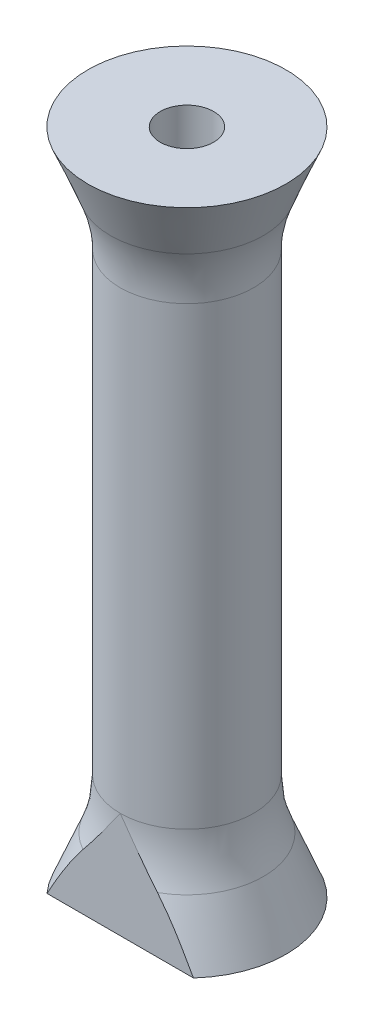
ISO-10303-21;
HEADER;
FILE_DESCRIPTION(('STEP AP214'),'2;1');
FILE_NAME('part.step','',(''),(''),'','','');
FILE_SCHEMA(('AUTOMOTIVE_DESIGN { 1 0 10303 214 1 1 1 1 }'));
ENDSEC;
DATA;
#1=APPLICATION_CONTEXT('core data for automotive mechanical design processes');
#2=APPLICATION_PROTOCOL_DEFINITION('international standard','automotive_design',2000,#1);
#3=PRODUCT_CONTEXT('',#1,'mechanical');
#4=PRODUCT('Part','Part','',(#3));
#5=PRODUCT_RELATED_PRODUCT_CATEGORY('part','',(#4));
#6=PRODUCT_DEFINITION_FORMATION('','',#4);
#7=PRODUCT_DEFINITION_CONTEXT('part definition',#1,'design');
#8=PRODUCT_DEFINITION('design','',#6,#7);
#9=PRODUCT_DEFINITION_SHAPE('','',#8);
#10=(LENGTH_UNIT() NAMED_UNIT(*) SI_UNIT(.MILLI.,.METRE.));
#11=(NAMED_UNIT(*) PLANE_ANGLE_UNIT() SI_UNIT($,.RADIAN.));
#12=(NAMED_UNIT(*) SI_UNIT($,.STERADIAN.) SOLID_ANGLE_UNIT());
#13=UNCERTAINTY_MEASURE_WITH_UNIT(LENGTH_MEASURE(1.E-05),#10,'distance_accuracy_value','');
#14=(GEOMETRIC_REPRESENTATION_CONTEXT(3) GLOBAL_UNCERTAINTY_ASSIGNED_CONTEXT((#13)) GLOBAL_UNIT_ASSIGNED_CONTEXT((#10,
#11,#12)) REPRESENTATION_CONTEXT('',''));
#15=CARTESIAN_POINT('',(0.,0.,0.));
#16=DIRECTION('',(0.,0.,1.));
#17=DIRECTION('',(1.,0.,0.));
#18=AXIS2_PLACEMENT_3D('',#15,#16,#17);
#19=CARTESIAN_POINT('',(0.,0.,0.));
#20=DIRECTION('',(0.,1.,0.));
#21=DIRECTION('',(0.,0.,1.));
#22=AXIS2_PLACEMENT_3D('',#19,#20,#21);
#23=PLANE('',#22);
#24=CARTESIAN_POINT('',(0.,0.,0.));
#25=DIRECTION('',(0.,1.,0.));
#26=DIRECTION('',(0.,0.,1.));
#27=AXIS2_PLACEMENT_3D('',#24,#25,#26);
#28=CIRCLE('',#27,2.54);
#29=CARTESIAN_POINT('',(0.,0.,2.54));
#30=VERTEX_POINT('',#29);
#31=EDGE_CURVE('E151',#30,#30,#28,.T.);
#32=ORIENTED_EDGE('',*,*,#31,.T.);
#33=EDGE_LOOP('',(#32));
#34=FACE_BOUND('',#33,.T.);
#35=DIRECTION('',(1.,0.,0.));
#36=VECTOR('',#35,1.);
#37=CARTESIAN_POINT('',(0.,0.,6.35));
#38=LINE('',#37,#36);
#39=CARTESIAN_POINT('',(-6.96975634735617,0.,6.35));
#40=VERTEX_POINT('',#39);
#41=CARTESIAN_POINT('',(6.96975634735616,0.,6.35));
#42=VERTEX_POINT('',#41);
#43=EDGE_CURVE('E154',#40,#42,#38,.T.);
#44=ORIENTED_EDGE('',*,*,#43,.F.);
#45=CARTESIAN_POINT('',(0.,0.,0.));
#46=DIRECTION('',(0.,1.,0.));
#47=DIRECTION('',(0.,0.,1.));
#48=AXIS2_PLACEMENT_3D('',#45,#46,#47);
#49=CIRCLE('',#48,9.42867984086381);
#50=EDGE_CURVE('E91',#40,#42,#49,.F.);
#51=ORIENTED_EDGE('',*,*,#50,.T.);
#52=EDGE_LOOP('',(#44,#51));
#53=FACE_BOUND('',#52,.T.);
#54=ADVANCED_FACE('F39',(#34,#53),#23,.F.);
#55=CARTESIAN_POINT('',(0.,-0.238400759596957,0.));
#56=DIRECTION('',(0.,-1.,0.));
#57=DIRECTION('',(0.,0.,-1.));
#58=AXIS2_PLACEMENT_3D('',#55,#56,#57);
#59=CONICAL_SURFACE('',#58,9.525,0.383972435438749);
#60=ORIENTED_EDGE('',*,*,#50,.F.);
#61=CARTESIAN_POINT('',(-6.97013893900264,-0.000700000000000125,6.35));
#62=CARTESIAN_POINT('',(-6.81004517567397,0.292103212405889,6.35));
#63=CARTESIAN_POINT('',(-6.64810796811134,0.583919319770703,6.35));
#64=CARTESIAN_POINT('',(-6.31948772308124,1.16508200067252,6.35));
#65=CARTESIAN_POINT('',(-6.15280204437464,1.45442707868588,6.35));
#66=CARTESIAN_POINT('',(-5.81003488258008,2.0362184287613,6.35));
#67=CARTESIAN_POINT('',(-5.63382687181748,2.3285905036498,6.35));
#68=CARTESIAN_POINT('',(-5.27411564908504,2.90868691650786,6.35));
#69=CARTESIAN_POINT('',(-5.09061496582144,3.19641281768469,6.35));
#70=CARTESIAN_POINT('',(-4.71401407427171,3.76606259331294,6.35));
#71=CARTESIAN_POINT('',(-4.52090285869401,4.04797926642675,6.35));
#72=CARTESIAN_POINT('',(-4.22187436560798,4.46436943762836,6.35));
#73=CARTESIAN_POINT('',(-4.12057749019999,4.60216206892264,6.35));
#74=CARTESIAN_POINT('',(-3.9143867171157,4.87502330360309,6.35));
#75=CARTESIAN_POINT('',(-3.8094930946504,5.01009211415646,6.35));
#76=CARTESIAN_POINT('',(-3.59641049978492,5.27574332584678,6.35));
#77=CARTESIAN_POINT('',(-3.48825692562477,5.40635402020095,6.35));
#78=CARTESIAN_POINT('',(-3.26711438587949,5.66339850538937,6.35));
#79=CARTESIAN_POINT('',(-3.15412627156554,5.78983302467841,6.35));
#80=CARTESIAN_POINT('',(-2.92262042899128,6.03714443441524,6.35));
#81=CARTESIAN_POINT('',(-2.80411283287643,6.15803075778584,6.35));
#82=CARTESIAN_POINT('',(-2.56037206007978,6.39277697152771,6.35));
#83=CARTESIAN_POINT('',(-2.43514236117838,6.50664043098626,6.35));
#84=CARTESIAN_POINT('',(-2.22608875177381,6.68324512688701,6.35));
#85=CARTESIAN_POINT('',(-2.14472956579056,6.74889453982832,6.35));
#86=CARTESIAN_POINT('',(-1.97866769544393,6.87581945886737,6.35));
#87=CARTESIAN_POINT('',(-1.8939645474711,6.93709435514814,6.35));
#88=CARTESIAN_POINT('',(-1.63453332744474,7.11289844141844,6.35));
#89=CARTESIAN_POINT('',(-1.45425334817479,7.21960802754281,6.35));
#90=CARTESIAN_POINT('',(-1.11787243456945,7.3823484789556,6.35));
#91=CARTESIAN_POINT('',(-0.964727609792902,7.44432513325945,6.35));
#92=CARTESIAN_POINT('',(-0.729052649699295,7.51793228799181,6.35));
#93=CARTESIAN_POINT('',(-0.649514668273621,7.53923982750899,6.35));
#94=CARTESIAN_POINT('',(-0.4888809654685,7.57473032610451,6.35));
#95=CARTESIAN_POINT('',(-0.407786019009823,7.58891673866674,6.35));
#96=CARTESIAN_POINT('',(-0.243877713400388,7.60972924419288,6.35));
#97=CARTESIAN_POINT('',(-0.161055447478268,7.61628584710751,6.35));
#98=CARTESIAN_POINT('',(0.00483399240188284,7.62133609919837,6.35));
#99=CARTESIAN_POINT('',(0.0879011582394427,7.61983001278036,6.35));
#100=CARTESIAN_POINT('',(0.253497604666313,7.60881459639695,6.35));
#101=CARTESIAN_POINT('',(0.336026907127897,7.59930559394339,6.35));
#102=CARTESIAN_POINT('',(0.499867335378266,7.57268174091587,6.35));
#103=CARTESIAN_POINT('',(0.581177762981086,7.5555626912991,6.35));
#104=CARTESIAN_POINT('',(0.84626732915803,7.48753503596905,6.35));
#105=CARTESIAN_POINT('',(1.02628597348128,7.42158758362363,6.35));
#106=CARTESIAN_POINT('',(1.37353531927445,7.26213874774928,6.35));
#107=CARTESIAN_POINT('',(1.54073177199306,7.16856659981635,6.35));
#108=CARTESIAN_POINT('',(1.85006588000982,6.97036546006456,6.35));
#109=CARTESIAN_POINT('',(1.99314094474013,6.86716702254104,6.35));
#110=CARTESIAN_POINT('',(2.27011474074859,6.64901472935314,6.35));
#111=CARTESIAN_POINT('',(2.4040044346438,6.53404956593007,6.35));
#112=CARTESIAN_POINT('',(2.66496584524021,6.2946562707452,6.35));
#113=CARTESIAN_POINT('',(2.791973260494,6.17015878565897,6.35));
#114=CARTESIAN_POINT('',(3.03922167998365,5.91479537239364,6.35));
#115=CARTESIAN_POINT('',(3.15946612751724,5.78393274942608,6.35));
#116=CARTESIAN_POINT('',(3.46917522210618,5.4324310283743,6.35));
#117=CARTESIAN_POINT('',(3.6539638784277,5.20768396052708,6.35));
#118=CARTESIAN_POINT('',(4.0122806609347,4.74933364978468,6.35));
#119=CARTESIAN_POINT('',(4.18580308031376,4.51572601210738,6.35));
#120=CARTESIAN_POINT('',(4.52445476218815,4.04165265961593,6.35));
#121=CARTESIAN_POINT('',(4.6895619399301,3.80117124900004,6.35));
#122=CARTESIAN_POINT('',(5.01276166978252,3.31553489552609,6.35));
#123=CARTESIAN_POINT('',(5.17085359413571,3.07037953721661,6.35));
#124=CARTESIAN_POINT('',(5.47150602103984,2.59216515779034,6.35));
#125=CARTESIAN_POINT('',(5.6144157079782,2.35932484648929,6.35));
#126=CARTESIAN_POINT('',(5.89609047143868,1.89113411022604,6.35));
#127=CARTESIAN_POINT('',(6.03485525898995,1.65578351179869,6.35));
#128=CARTESIAN_POINT('',(6.30805689305711,1.18449393108008,6.35));
#129=CARTESIAN_POINT('',(6.4425148849503,0.948567175528929,6.35));
#130=CARTESIAN_POINT('',(6.70844140062923,0.475083254206333,6.35));
#131=CARTESIAN_POINT('',(6.83991040079254,0.23752635621156,6.35));
#132=CARTESIAN_POINT('',(6.97013893900274,-0.000699999999908097,6.35));
#133=B_SPLINE_CURVE_WITH_KNOTS('',3,(#61,#62,#63,#64,#65,#66,#67,#68,#69,#70,#71,#72,#73,#74,
#75,#76,#77,#78,#79,#80,#81,#82,#83,#84,#85,#86,#87,#88,#89,#90,#91,#92,#93,#94,#95,#96,#97,#98,
#99,#100,#101,#102,#103,#104,#105,#106,#107,#108,#109,#110,#111,#112,#113,#114,#115,#116,#117,
#118,#119,#120,#121,#122,#123,#124,#125,#126,#127,#128,#129,#130,#131,#132),.UNSPECIFIED.,.F.,
.F.,(4,2,2,2,2,2,2,2,2,2,2,2,2,2,2,2,2,2,2,2,2,2,2,2,2,2,2,2,2,2,2,2,2,2,2,4),(0.,
1.00115644808138,2.00288108175956,3.0268894601828,4.05054581371938,5.07540286398049,
5.5884167468968,6.10139146292962,6.61002518109493,7.11856970409367,7.62621489677029,
8.13359993658918,8.44709176513384,8.76062721011916,9.38678631370557,9.88044487999217,
10.1271946774974,10.3738246945615,10.6226837870805,10.8715347186282,11.1203754666798,
11.3693536898881,11.940983888247,12.5140912920629,13.042522515622,13.571466413618,
14.1047118955755,14.6376833763588,15.5100166595783,16.3827884220977,17.2577437487267,
18.1327772131589,18.9523242986994,19.7719283880546,20.5865613399548,21.4010635345266),.UNSPECIFIED.);
#134=CARTESIAN_POINT('',(-3.5496065259517,5.33112618966682,6.35));
#135=VERTEX_POINT('',#134);
#136=EDGE_CURVE('E65',#40,#135,#133,.T.);
#137=ORIENTED_EDGE('',*,*,#136,.T.);
#138=CARTESIAN_POINT('',(0.,5.33112618966682,0.));
#139=DIRECTION('',(0.,1.,0.));
#140=DIRECTION('',(0.,0.,1.));
#141=AXIS2_PLACEMENT_3D('',#138,#139,#140);
#142=CIRCLE('',#141,7.27476504700178);
#143=CARTESIAN_POINT('',(3.5496065259517,5.33112618966682,6.35));
#144=VERTEX_POINT('',#143);
#145=EDGE_CURVE('E82',#135,#144,#142,.F.);
#146=ORIENTED_EDGE('',*,*,#145,.T.);
#147=EDGE_CURVE('E60',#144,#42,#133,.T.);
#148=ORIENTED_EDGE('',*,*,#147,.T.);
#149=EDGE_LOOP('',(#60,#137,#146,#148));
#150=FACE_BOUND('',#149,.T.);
#151=ADVANCED_FACE('F107',(#150),#59,.T.);
#152=CARTESIAN_POINT('',(0.,10.0886299260489,0.));
#153=DIRECTION('',(0.,-1.,0.));
#154=DIRECTION('',(0.,0.,-1.));
#155=AXIS2_PLACEMENT_3D('',#152,#153,#154);
#156=TOROIDAL_SURFACE('',#155,19.05,12.7);
#157=CARTESIAN_POINT('',(0.,10.0886299260489,6.35));
#158=CARTESIAN_POINT('',(-0.00433759777164589,10.0824956320214,6.35));
#159=CARTESIAN_POINT('',(-0.00867520256478168,10.0763613325385,6.35));
#160=CARTESIAN_POINT('',(-0.633256348061171,9.19307292394192,6.35));
#161=CARTESIAN_POINT('',(-1.25377938411385,8.31590861165454,6.35));
#162=CARTESIAN_POINT('',(-2.21435803418364,7.02159150882193,6.35));
#163=CARTESIAN_POINT('',(-2.53963162890958,6.59358294082852,6.35));
#164=CARTESIAN_POINT('',(-3.20443517125072,5.74873670818634,6.35));
#165=CARTESIAN_POINT('',(-3.54396448270959,5.3318985464192,6.35));
#166=CARTESIAN_POINT('',(-4.23802949207585,4.51724839889304,6.35));
#167=CARTESIAN_POINT('',(-4.59240291352514,4.1192990959117,6.35));
#168=CARTESIAN_POINT('',(-5.32194010506707,3.34296935215213,6.35));
#169=CARTESIAN_POINT('',(-5.6970993642744,2.96458469969859,6.35));
#170=CARTESIAN_POINT('',(-6.4698388217568,2.23261254002799,6.35));
#171=CARTESIAN_POINT('',(-6.86738154691996,1.87898568834324,6.35));
#172=CARTESIAN_POINT('',(-7.68649547709928,1.20093829294941,6.35));
#173=CARTESIAN_POINT('',(-8.10805569086619,0.876504562015245,6.35));
#174=CARTESIAN_POINT('',(-8.89703037551857,0.317349233792617,6.35));
#175=CARTESIAN_POINT('',(-9.26046251203705,0.0770106380098773,6.35));
#176=CARTESIAN_POINT('',(-10.0030342728683,-0.37791278949217,6.35));
#177=CARTESIAN_POINT('',(-10.3821702056453,-0.592503628107306,6.35));
#178=CARTESIAN_POINT('',(-11.1625645090648,-0.997043438623623,6.35));
#179=CARTESIAN_POINT('',(-11.564105032705,-1.18645224474474,6.35));
#180=CARTESIAN_POINT('',(-12.1768005888177,-1.44639356784458,6.35));
#181=CARTESIAN_POINT('',(-12.3828751549838,-1.52904939682536,6.35));
#182=CARTESIAN_POINT('',(-12.7982228921676,-1.68596154801072,6.35));
#183=CARTESIAN_POINT('',(-13.0074964228324,-1.76021691778222,6.35));
#184=CARTESIAN_POINT('',(-13.2182470726855,-1.83011544422518,6.35));
#185=B_SPLINE_CURVE_WITH_KNOTS('',3,(#157,#158,#159,#160,#161,#162,#163,#164,#165,#166,#167,
#168,#169,#170,#171,#172,#173,#174,#175,#176,#177,#178,#179,#180,#181,#182,#183,#184),
.UNSPECIFIED.,.F.,.F.,(4,2,2,2,2,2,2,2,2,2,2,2,2,4),(0.,0.0225388553391719,3.2454085588652,
4.85793426642827,6.47038809192242,8.06835143796614,9.66596934647811,11.2609878530028,
12.8552821963086,14.1614635358387,15.4673395511326,16.7978080926955,17.4637482672017,
18.1297638696251),.UNSPECIFIED.);
#186=CARTESIAN_POINT('',(0.,10.0886299260489,6.35));
#187=VERTEX_POINT('',#186);
#188=EDGE_CURVE('E11',#187,#135,#185,.T.);
#189=ORIENTED_EDGE('',*,*,#188,.F.);
#190=CARTESIAN_POINT('',(0.,10.0886299260489,0.));
#191=DIRECTION('',(0.,-1.,0.));
#192=DIRECTION('',(0.,0.,-1.));
#193=AXIS2_PLACEMENT_3D('',#190,#191,#192);
#194=CIRCLE('',#193,6.35);
#195=EDGE_CURVE('E81',#187,#187,#194,.F.);
#196=ORIENTED_EDGE('',*,*,#195,.F.);
#197=CARTESIAN_POINT('',(0.,10.0886299260489,6.35));
#198=CARTESIAN_POINT('',(0.00433759777164589,10.0824956320214,6.35));
#199=CARTESIAN_POINT('',(0.00867520256478168,10.0763613325385,6.35));
#200=CARTESIAN_POINT('',(0.633256348061171,9.19307292394192,6.35));
#201=CARTESIAN_POINT('',(1.25377938411385,8.31590861165454,6.35));
#202=CARTESIAN_POINT('',(2.21435803418364,7.02159150882193,6.35));
#203=CARTESIAN_POINT('',(2.53963162890958,6.59358294082852,6.35));
#204=CARTESIAN_POINT('',(3.20443517125072,5.74873670818634,6.35));
#205=CARTESIAN_POINT('',(3.54396448270959,5.3318985464192,6.35));
#206=CARTESIAN_POINT('',(4.23802949207585,4.51724839889304,6.35));
#207=CARTESIAN_POINT('',(4.59240291352514,4.1192990959117,6.35));
#208=CARTESIAN_POINT('',(5.32194010506707,3.34296935215213,6.35));
#209=CARTESIAN_POINT('',(5.6970993642744,2.96458469969859,6.35));
#210=CARTESIAN_POINT('',(6.4698388217568,2.23261254002799,6.35));
#211=CARTESIAN_POINT('',(6.86738154691996,1.87898568834324,6.35));
#212=CARTESIAN_POINT('',(7.68649547709928,1.20093829294941,6.35));
#213=CARTESIAN_POINT('',(8.10805569086619,0.876504562015245,6.35));
#214=CARTESIAN_POINT('',(8.89703037551857,0.317349233792617,6.35));
#215=CARTESIAN_POINT('',(9.26046251203705,0.0770106380098773,6.35));
#216=CARTESIAN_POINT('',(10.0030342728683,-0.37791278949217,6.35));
#217=CARTESIAN_POINT('',(10.3821702056453,-0.592503628107306,6.35));
#218=CARTESIAN_POINT('',(11.1625645090648,-0.997043438623623,6.35));
#219=CARTESIAN_POINT('',(11.564105032705,-1.18645224474474,6.35));
#220=CARTESIAN_POINT('',(12.1768005888177,-1.44639356784458,6.35));
#221=CARTESIAN_POINT('',(12.3828751549838,-1.52904939682536,6.35));
#222=CARTESIAN_POINT('',(12.7982228921676,-1.68596154801072,6.35));
#223=CARTESIAN_POINT('',(13.0074964228324,-1.76021691778222,6.35));
#224=CARTESIAN_POINT('',(13.2182470726855,-1.83011544422518,6.35));
#225=B_SPLINE_CURVE_WITH_KNOTS('',3,(#197,#198,#199,#200,#201,#202,#203,#204,#205,#206,#207,
#208,#209,#210,#211,#212,#213,#214,#215,#216,#217,#218,#219,#220,#221,#222,#223,#224),
.UNSPECIFIED.,.F.,.F.,(4,2,2,2,2,2,2,2,2,2,2,2,2,4),(0.,0.0225388553391719,3.2454085588652,
4.85793426642827,6.47038809192242,8.06835143796614,9.66596934647811,11.2609878530028,
12.8552821963086,14.1614635358387,15.4673395511326,16.7978080926955,17.4637482672017,
18.1297638696251),.UNSPECIFIED.);
#226=EDGE_CURVE('E53',#144,#187,#225,.F.);
#227=ORIENTED_EDGE('',*,*,#226,.F.);
#228=ORIENTED_EDGE('',*,*,#145,.F.);
#229=EDGE_LOOP('',(#189,#196,#227,#228));
#230=FACE_BOUND('',#229,.T.);
#231=ADVANCED_FACE('F80',(#230),#156,.F.);
#232=CARTESIAN_POINT('',(0.,63.5,0.));
#233=DIRECTION('',(0.,-1.,0.));
#234=DIRECTION('',(0.,0.,-1.));
#235=AXIS2_PLACEMENT_3D('',#232,#233,#234);
#236=CYLINDRICAL_SURFACE('',#235,6.35);
#237=ORIENTED_EDGE('',*,*,#195,.T.);
#238=EDGE_LOOP('',(#237));
#239=FACE_BOUND('',#238,.T.);
#240=CARTESIAN_POINT('',(0.,53.4113700739511,0.));
#241=DIRECTION('',(0.,1.,0.));
#242=DIRECTION('',(0.,0.,1.));
#243=AXIS2_PLACEMENT_3D('',#240,#241,#242);
#244=CIRCLE('',#243,6.35);
#245=CARTESIAN_POINT('',(0.,53.4113700739511,6.35));
#246=VERTEX_POINT('',#245);
#247=EDGE_CURVE('E78',#246,#246,#244,.F.);
#248=ORIENTED_EDGE('',*,*,#247,.T.);
#249=EDGE_LOOP('',(#248));
#250=FACE_BOUND('',#249,.T.);
#251=ADVANCED_FACE('F84',(#239,#250),#236,.T.);
#252=CARTESIAN_POINT('',(0.,63.5,0.));
#253=DIRECTION('',(0.,1.,0.));
#254=DIRECTION('',(0.,0.,1.));
#255=AXIS2_PLACEMENT_3D('',#252,#253,#254);
#256=PLANE('',#255);
#257=CARTESIAN_POINT('',(0.,63.5,0.));
#258=DIRECTION('',(0.,1.,0.));
#259=DIRECTION('',(0.,0.,1.));
#260=AXIS2_PLACEMENT_3D('',#257,#258,#259);
#261=CIRCLE('',#260,9.42867984086381);
#262=CARTESIAN_POINT('',(0.,63.5,9.42867984086381));
#263=VERTEX_POINT('',#262);
#264=EDGE_CURVE('E86',#263,#263,#261,.T.);
#265=ORIENTED_EDGE('',*,*,#264,.T.);
#266=EDGE_LOOP('',(#265));
#267=FACE_BOUND('',#266,.T.);
#268=CARTESIAN_POINT('',(0.,63.5,0.));
#269=DIRECTION('',(0.,1.,0.));
#270=DIRECTION('',(0.,0.,1.));
#271=AXIS2_PLACEMENT_3D('',#268,#269,#270);
#272=CIRCLE('',#271,2.54);
#273=CARTESIAN_POINT('',(0.,63.5,2.54));
#274=VERTEX_POINT('',#273);
#275=EDGE_CURVE('E150',#274,#274,#272,.T.);
#276=ORIENTED_EDGE('',*,*,#275,.F.);
#277=EDGE_LOOP('',(#276));
#278=FACE_BOUND('',#277,.T.);
#279=ADVANCED_FACE('F125',(#267,#278),#256,.T.);
#280=CARTESIAN_POINT('',(0.,63.5,0.));
#281=DIRECTION('',(0.,-1.,0.));
#282=DIRECTION('',(0.,0.,-1.));
#283=AXIS2_PLACEMENT_3D('',#280,#281,#282);
#284=CYLINDRICAL_SURFACE('',#283,2.54);
#285=ORIENTED_EDGE('',*,*,#275,.T.);
#286=EDGE_LOOP('',(#285));
#287=FACE_BOUND('',#286,.T.);
#288=ORIENTED_EDGE('',*,*,#31,.F.);
#289=EDGE_LOOP('',(#288));
#290=FACE_BOUND('',#289,.T.);
#291=ADVANCED_FACE('F117',(#287,#290),#284,.F.);
#292=CARTESIAN_POINT('',(0.,63.738400759597,0.));
#293=DIRECTION('',(0.,1.,0.));
#294=DIRECTION('',(0.,0.,1.));
#295=AXIS2_PLACEMENT_3D('',#292,#293,#294);
#296=CONICAL_SURFACE('',#295,9.525,0.383972435438749);
#297=CARTESIAN_POINT('',(0.,58.1688738103332,0.));
#298=DIRECTION('',(0.,-1.,0.));
#299=DIRECTION('',(0.,0.,-1.));
#300=AXIS2_PLACEMENT_3D('',#297,#298,#299);
#301=CIRCLE('',#300,7.27476504700178);
#302=CARTESIAN_POINT('',(0.,58.1688738103332,-7.27476504700178));
#303=VERTEX_POINT('',#302);
#304=EDGE_CURVE('E89',#303,#303,#301,.F.);
#305=ORIENTED_EDGE('',*,*,#304,.T.);
#306=EDGE_LOOP('',(#305));
#307=FACE_BOUND('',#306,.T.);
#308=ORIENTED_EDGE('',*,*,#264,.F.);
#309=EDGE_LOOP('',(#308));
#310=FACE_BOUND('',#309,.T.);
#311=ADVANCED_FACE('F112',(#307,#310),#296,.T.);
#312=CARTESIAN_POINT('',(0.,53.4113700739511,0.));
#313=DIRECTION('',(0.,1.,0.));
#314=DIRECTION('',(0.,0.,1.));
#315=AXIS2_PLACEMENT_3D('',#312,#313,#314);
#316=TOROIDAL_SURFACE('',#315,19.05,12.7);
#317=ORIENTED_EDGE('',*,*,#247,.F.);
#318=EDGE_LOOP('',(#317));
#319=FACE_BOUND('',#318,.T.);
#320=ORIENTED_EDGE('',*,*,#304,.F.);
#321=EDGE_LOOP('',(#320));
#322=FACE_BOUND('',#321,.T.);
#323=ADVANCED_FACE('F41',(#319,#322),#316,.F.);
#324=CARTESIAN_POINT('',(0.,0.,6.35));
#325=DIRECTION('',(0.,0.,1.));
#326=DIRECTION('',(1.,0.,0.));
#327=AXIS2_PLACEMENT_3D('',#324,#325,#326);
#328=PLANE('',#327);
#329=ORIENTED_EDGE('',*,*,#43,.T.);
#330=ORIENTED_EDGE('',*,*,#147,.F.);
#331=ORIENTED_EDGE('',*,*,#226,.T.);
#332=ORIENTED_EDGE('',*,*,#188,.T.);
#333=ORIENTED_EDGE('',*,*,#136,.F.);
#334=EDGE_LOOP('',(#329,#330,#331,#332,#333));
#335=FACE_BOUND('',#334,.T.);
#336=ADVANCED_FACE('F73',(#335),#328,.T.);
#337=CLOSED_SHELL('',(#54,#151,#231,#251,#279,#291,#311,#323,#336));
#338=MANIFOLD_SOLID_BREP('B2',#337);
#339=ADVANCED_BREP_SHAPE_REPRESENTATION('',(#18,#338),#14);
#340=SHAPE_DEFINITION_REPRESENTATION(#9,#339);
ENDSEC;
END-ISO-10303-21;
